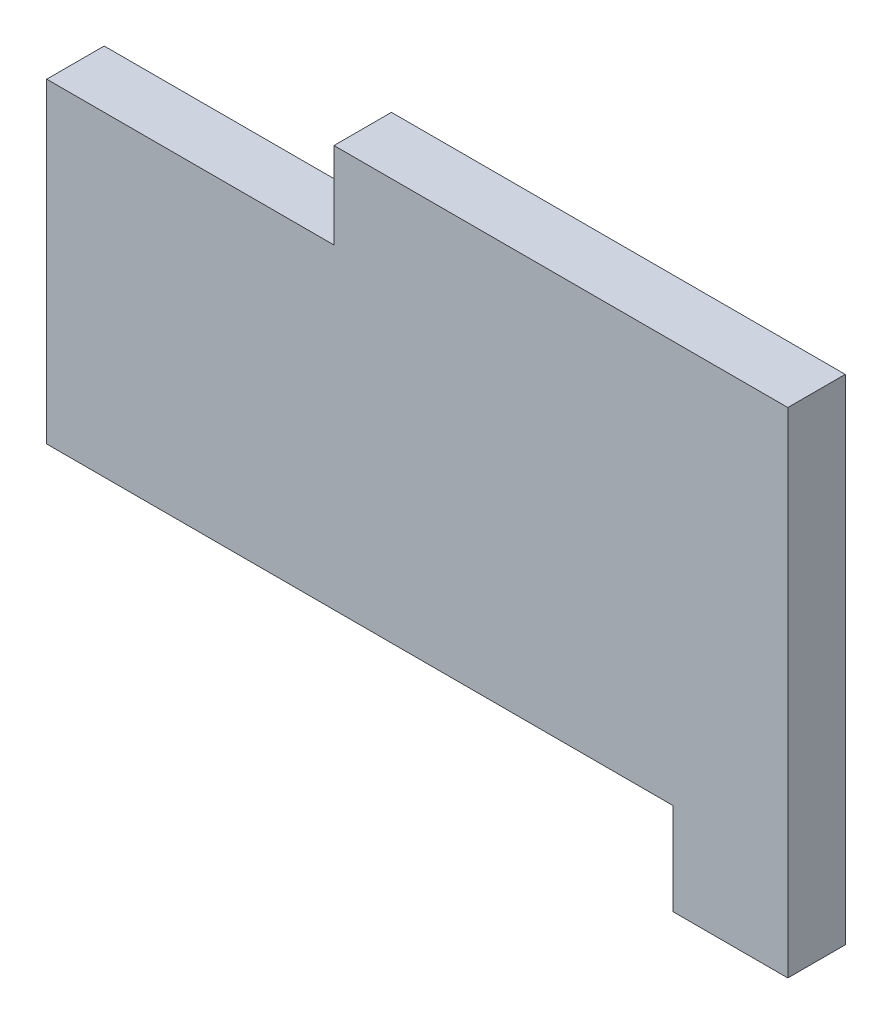
ISO-10303-21;
HEADER;
FILE_DESCRIPTION(('STEP AP214'),'2;1');
FILE_NAME('part.step','',(''),(''),'','','');
FILE_SCHEMA(('AUTOMOTIVE_DESIGN { 1 0 10303 214 1 1 1 1 }'));
ENDSEC;
DATA;
#1=APPLICATION_CONTEXT('core data for automotive mechanical design processes');
#2=APPLICATION_PROTOCOL_DEFINITION('international standard','automotive_design',2000,#1);
#3=PRODUCT_CONTEXT('',#1,'mechanical');
#4=PRODUCT('Part','Part','',(#3));
#5=PRODUCT_RELATED_PRODUCT_CATEGORY('part','',(#4));
#6=PRODUCT_DEFINITION_FORMATION('','',#4);
#7=PRODUCT_DEFINITION_CONTEXT('part definition',#1,'design');
#8=PRODUCT_DEFINITION('design','',#6,#7);
#9=PRODUCT_DEFINITION_SHAPE('','',#8);
#10=(LENGTH_UNIT() NAMED_UNIT(*) SI_UNIT(.MILLI.,.METRE.));
#11=(NAMED_UNIT(*) PLANE_ANGLE_UNIT() SI_UNIT($,.RADIAN.));
#12=(NAMED_UNIT(*) SI_UNIT($,.STERADIAN.) SOLID_ANGLE_UNIT());
#13=UNCERTAINTY_MEASURE_WITH_UNIT(LENGTH_MEASURE(1.E-05),#10,'distance_accuracy_value','');
#14=(GEOMETRIC_REPRESENTATION_CONTEXT(3) GLOBAL_UNCERTAINTY_ASSIGNED_CONTEXT((#13)) GLOBAL_UNIT_ASSIGNED_CONTEXT((#10,
#11,#12)) REPRESENTATION_CONTEXT('',''));
#15=CARTESIAN_POINT('',(0.,0.,0.));
#16=DIRECTION('',(0.,0.,1.));
#17=DIRECTION('',(1.,0.,0.));
#18=AXIS2_PLACEMENT_3D('',#15,#16,#17);
#19=CARTESIAN_POINT('',(-3.46363636363629,8.7283636363636,2.54));
#20=DIRECTION('',(0.,-1.,0.));
#21=DIRECTION('',(0.,0.,-1.));
#22=AXIS2_PLACEMENT_3D('',#19,#20,#21);
#23=PLANE('',#22);
#24=DIRECTION('',(-1.,0.,0.));
#25=VECTOR('',#24,1.);
#26=CARTESIAN_POINT('',(-3.46363636363629,8.7283636363636,0.));
#27=LINE('',#26,#25);
#28=CARTESIAN_POINT('',(-3.46363636363629,8.7283636363636,0.));
#29=VERTEX_POINT('',#28);
#30=CARTESIAN_POINT('',(-16.1636363636363,8.7283636363636,0.));
#31=VERTEX_POINT('',#30);
#32=EDGE_CURVE('E140',#29,#31,#27,.T.);
#33=ORIENTED_EDGE('',*,*,#32,.T.);
#34=DIRECTION('',(0.,0.,-1.));
#35=VECTOR('',#34,1.);
#36=CARTESIAN_POINT('',(-16.1636363636363,8.7283636363636,2.54));
#37=LINE('',#36,#35);
#38=CARTESIAN_POINT('',(-16.1636363636363,8.7283636363636,2.54));
#39=VERTEX_POINT('',#38);
#40=EDGE_CURVE('E11',#39,#31,#37,.T.);
#41=ORIENTED_EDGE('',*,*,#40,.F.);
#42=DIRECTION('',(-1.,0.,0.));
#43=VECTOR('',#42,1.);
#44=CARTESIAN_POINT('',(-3.46363636363629,8.7283636363636,2.54));
#45=LINE('',#44,#43);
#46=CARTESIAN_POINT('',(-3.46363636363629,8.7283636363636,2.54));
#47=VERTEX_POINT('',#46);
#48=EDGE_CURVE('E162',#47,#39,#45,.T.);
#49=ORIENTED_EDGE('',*,*,#48,.F.);
#50=DIRECTION('',(0.,0.,-1.));
#51=VECTOR('',#50,1.);
#52=CARTESIAN_POINT('',(-3.46363636363629,8.7283636363636,2.54));
#53=LINE('',#52,#51);
#54=EDGE_CURVE('E136',#47,#29,#53,.T.);
#55=ORIENTED_EDGE('',*,*,#54,.T.);
#56=EDGE_LOOP('',(#33,#41,#49,#55));
#57=FACE_BOUND('',#56,.T.);
#58=ADVANCED_FACE('F39',(#57),#23,.F.);
#59=CARTESIAN_POINT('',(-16.1636363636363,8.7283636363636,2.54));
#60=DIRECTION('',(1.,0.,0.));
#61=DIRECTION('',(0.,0.,-1.));
#62=AXIS2_PLACEMENT_3D('',#59,#60,#61);
#63=PLANE('',#62);
#64=DIRECTION('',(0.,-1.,0.));
#65=VECTOR('',#64,1.);
#66=CARTESIAN_POINT('',(-16.1636363636363,8.7283636363636,0.));
#67=LINE('',#66,#65);
#68=CARTESIAN_POINT('',(-16.1636363636363,-5.2416363636364,0.));
#69=VERTEX_POINT('',#68);
#70=EDGE_CURVE('E144',#31,#69,#67,.T.);
#71=ORIENTED_EDGE('',*,*,#70,.T.);
#72=DIRECTION('',(0.,0.,-1.));
#73=VECTOR('',#72,1.);
#74=CARTESIAN_POINT('',(-16.1636363636363,-5.2416363636364,2.54));
#75=LINE('',#74,#73);
#76=CARTESIAN_POINT('',(-16.1636363636363,-5.2416363636364,2.54));
#77=VERTEX_POINT('',#76);
#78=EDGE_CURVE('E48',#77,#69,#75,.T.);
#79=ORIENTED_EDGE('',*,*,#78,.F.);
#80=DIRECTION('',(0.,-1.,0.));
#81=VECTOR('',#80,1.);
#82=CARTESIAN_POINT('',(-16.1636363636363,8.7283636363636,2.54));
#83=LINE('',#82,#81);
#84=EDGE_CURVE('E99',#39,#77,#83,.T.);
#85=ORIENTED_EDGE('',*,*,#84,.F.);
#86=ORIENTED_EDGE('',*,*,#40,.T.);
#87=EDGE_LOOP('',(#71,#79,#85,#86));
#88=FACE_BOUND('',#87,.T.);
#89=ADVANCED_FACE('F208',(#88),#63,.F.);
#90=CARTESIAN_POINT('',(-16.1636363636363,-5.2416363636364,2.54));
#91=DIRECTION('',(0.,1.,0.));
#92=DIRECTION('',(-1.,0.,0.));
#93=AXIS2_PLACEMENT_3D('',#90,#91,#92);
#94=PLANE('',#93);
#95=DIRECTION('',(1.,0.,0.));
#96=VECTOR('',#95,1.);
#97=CARTESIAN_POINT('',(-16.1636363636363,-5.2416363636364,0.));
#98=LINE('',#97,#96);
#99=CARTESIAN_POINT('',(11.5223636363637,-5.2416363636364,0.));
#100=VERTEX_POINT('',#99);
#101=EDGE_CURVE('E147',#69,#100,#98,.T.);
#102=ORIENTED_EDGE('',*,*,#101,.T.);
#103=DIRECTION('',(0.,0.,-1.));
#104=VECTOR('',#103,1.);
#105=CARTESIAN_POINT('',(11.5223636363637,-5.2416363636364,2.54));
#106=LINE('',#105,#104);
#107=CARTESIAN_POINT('',(11.5223636363637,-5.2416363636364,2.54));
#108=VERTEX_POINT('',#107);
#109=EDGE_CURVE('E173',#108,#100,#106,.T.);
#110=ORIENTED_EDGE('',*,*,#109,.F.);
#111=DIRECTION('',(1.,0.,0.));
#112=VECTOR('',#111,1.);
#113=CARTESIAN_POINT('',(-16.1636363636363,-5.2416363636364,2.54));
#114=LINE('',#113,#112);
#115=EDGE_CURVE('E183',#77,#108,#114,.T.);
#116=ORIENTED_EDGE('',*,*,#115,.F.);
#117=ORIENTED_EDGE('',*,*,#78,.T.);
#118=EDGE_LOOP('',(#102,#110,#116,#117));
#119=FACE_BOUND('',#118,.T.);
#120=ADVANCED_FACE('F181',(#119),#94,.F.);
#121=CARTESIAN_POINT('',(11.5223636363637,-5.2416363636364,2.54));
#122=DIRECTION('',(1.,0.,0.));
#123=DIRECTION('',(0.,0.,-1.));
#124=AXIS2_PLACEMENT_3D('',#121,#122,#123);
#125=PLANE('',#124);
#126=DIRECTION('',(0.,-1.,0.));
#127=VECTOR('',#126,1.);
#128=CARTESIAN_POINT('',(11.5223636363637,-5.2416363636364,0.));
#129=LINE('',#128,#127);
#130=CARTESIAN_POINT('',(11.5223636363637,-9.30563636363638,0.));
#131=VERTEX_POINT('',#130);
#132=EDGE_CURVE('E150',#100,#131,#129,.T.);
#133=ORIENTED_EDGE('',*,*,#132,.T.);
#134=DIRECTION('',(0.,0.,-1.));
#135=VECTOR('',#134,1.);
#136=CARTESIAN_POINT('',(11.5223636363637,-9.30563636363638,2.54));
#137=LINE('',#136,#135);
#138=CARTESIAN_POINT('',(11.5223636363637,-9.30563636363638,2.54));
#139=VERTEX_POINT('',#138);
#140=EDGE_CURVE('E169',#139,#131,#137,.T.);
#141=ORIENTED_EDGE('',*,*,#140,.F.);
#142=DIRECTION('',(0.,-1.,0.));
#143=VECTOR('',#142,1.);
#144=CARTESIAN_POINT('',(11.5223636363637,-5.2416363636364,2.54));
#145=LINE('',#144,#143);
#146=EDGE_CURVE('E196',#108,#139,#145,.T.);
#147=ORIENTED_EDGE('',*,*,#146,.F.);
#148=ORIENTED_EDGE('',*,*,#109,.T.);
#149=EDGE_LOOP('',(#133,#141,#147,#148));
#150=FACE_BOUND('',#149,.T.);
#151=ADVANCED_FACE('F191',(#150),#125,.F.);
#152=CARTESIAN_POINT('',(11.5223636363637,-9.30563636363638,2.54));
#153=DIRECTION('',(0.,1.,0.));
#154=DIRECTION('',(-1.,0.,0.));
#155=AXIS2_PLACEMENT_3D('',#152,#153,#154);
#156=PLANE('',#155);
#157=DIRECTION('',(1.,0.,0.));
#158=VECTOR('',#157,1.);
#159=CARTESIAN_POINT('',(11.5223636363637,-9.30563636363638,0.));
#160=LINE('',#159,#158);
#161=CARTESIAN_POINT('',(16.6023636363637,-9.30563636363638,0.));
#162=VERTEX_POINT('',#161);
#163=EDGE_CURVE('E153',#131,#162,#160,.T.);
#164=ORIENTED_EDGE('',*,*,#163,.T.);
#165=DIRECTION('',(0.,0.,-1.));
#166=VECTOR('',#165,1.);
#167=CARTESIAN_POINT('',(16.6023636363637,-9.30563636363638,2.54));
#168=LINE('',#167,#166);
#169=CARTESIAN_POINT('',(16.6023636363637,-9.30563636363638,2.54));
#170=VERTEX_POINT('',#169);
#171=EDGE_CURVE('E129',#170,#162,#168,.T.);
#172=ORIENTED_EDGE('',*,*,#171,.F.);
#173=DIRECTION('',(1.,0.,0.));
#174=VECTOR('',#173,1.);
#175=CARTESIAN_POINT('',(11.5223636363637,-9.30563636363638,2.54));
#176=LINE('',#175,#174);
#177=EDGE_CURVE('E118',#139,#170,#176,.T.);
#178=ORIENTED_EDGE('',*,*,#177,.F.);
#179=ORIENTED_EDGE('',*,*,#140,.T.);
#180=EDGE_LOOP('',(#164,#172,#178,#179));
#181=FACE_BOUND('',#180,.T.);
#182=ADVANCED_FACE('F194',(#181),#156,.F.);
#183=CARTESIAN_POINT('',(16.6023636363637,-9.30563636363638,2.54));
#184=DIRECTION('',(-1.,0.,0.));
#185=DIRECTION('',(0.,-1.,0.));
#186=AXIS2_PLACEMENT_3D('',#183,#184,#185);
#187=PLANE('',#186);
#188=DIRECTION('',(0.,1.,0.));
#189=VECTOR('',#188,1.);
#190=CARTESIAN_POINT('',(16.6023636363637,-9.30563636363638,0.));
#191=LINE('',#190,#189);
#192=CARTESIAN_POINT('',(16.6023636363637,12.5383636363636,0.));
#193=VERTEX_POINT('',#192);
#194=EDGE_CURVE('E127',#162,#193,#191,.T.);
#195=ORIENTED_EDGE('',*,*,#194,.T.);
#196=DIRECTION('',(0.,0.,-1.));
#197=VECTOR('',#196,1.);
#198=CARTESIAN_POINT('',(16.6023636363637,12.5383636363636,2.54));
#199=LINE('',#198,#197);
#200=CARTESIAN_POINT('',(16.6023636363637,12.5383636363636,2.54));
#201=VERTEX_POINT('',#200);
#202=EDGE_CURVE('E124',#201,#193,#199,.T.);
#203=ORIENTED_EDGE('',*,*,#202,.F.);
#204=DIRECTION('',(0.,1.,0.));
#205=VECTOR('',#204,1.);
#206=CARTESIAN_POINT('',(16.6023636363637,-9.30563636363638,2.54));
#207=LINE('',#206,#205);
#208=EDGE_CURVE('E112',#170,#201,#207,.T.);
#209=ORIENTED_EDGE('',*,*,#208,.F.);
#210=ORIENTED_EDGE('',*,*,#171,.T.);
#211=EDGE_LOOP('',(#195,#203,#209,#210));
#212=FACE_BOUND('',#211,.T.);
#213=ADVANCED_FACE('F125',(#212),#187,.F.);
#214=CARTESIAN_POINT('',(16.6023636363637,12.5383636363636,2.54));
#215=DIRECTION('',(0.,-1.,0.));
#216=DIRECTION('',(1.,0.,0.));
#217=AXIS2_PLACEMENT_3D('',#214,#215,#216);
#218=PLANE('',#217);
#219=DIRECTION('',(-1.,0.,0.));
#220=VECTOR('',#219,1.);
#221=CARTESIAN_POINT('',(16.6023636363637,12.5383636363636,0.));
#222=LINE('',#221,#220);
#223=CARTESIAN_POINT('',(-3.46363636363629,12.5383636363636,0.));
#224=VERTEX_POINT('',#223);
#225=EDGE_CURVE('E85',#193,#224,#222,.T.);
#226=ORIENTED_EDGE('',*,*,#225,.T.);
#227=DIRECTION('',(0.,0.,-1.));
#228=VECTOR('',#227,1.);
#229=CARTESIAN_POINT('',(-3.46363636363629,12.5383636363636,2.54));
#230=LINE('',#229,#228);
#231=CARTESIAN_POINT('',(-3.46363636363629,12.5383636363636,2.54));
#232=VERTEX_POINT('',#231);
#233=EDGE_CURVE('E130',#232,#224,#230,.T.);
#234=ORIENTED_EDGE('',*,*,#233,.F.);
#235=DIRECTION('',(-1.,0.,0.));
#236=VECTOR('',#235,1.);
#237=CARTESIAN_POINT('',(16.6023636363637,12.5383636363636,2.54));
#238=LINE('',#237,#236);
#239=EDGE_CURVE('E116',#201,#232,#238,.T.);
#240=ORIENTED_EDGE('',*,*,#239,.F.);
#241=ORIENTED_EDGE('',*,*,#202,.T.);
#242=EDGE_LOOP('',(#226,#234,#240,#241));
#243=FACE_BOUND('',#242,.T.);
#244=ADVANCED_FACE('F132',(#243),#218,.F.);
#245=CARTESIAN_POINT('',(-3.46363636363629,12.5383636363636,2.54));
#246=DIRECTION('',(1.,0.,0.));
#247=DIRECTION('',(0.,1.,0.));
#248=AXIS2_PLACEMENT_3D('',#245,#246,#247);
#249=PLANE('',#248);
#250=DIRECTION('',(0.,-1.,0.));
#251=VECTOR('',#250,1.);
#252=CARTESIAN_POINT('',(-3.46363636363629,12.5383636363636,0.));
#253=LINE('',#252,#251);
#254=EDGE_CURVE('E91',#224,#29,#253,.T.);
#255=ORIENTED_EDGE('',*,*,#254,.T.);
#256=ORIENTED_EDGE('',*,*,#54,.F.);
#257=DIRECTION('',(0.,-1.,0.));
#258=VECTOR('',#257,1.);
#259=CARTESIAN_POINT('',(-3.46363636363629,12.5383636363636,2.54));
#260=LINE('',#259,#258);
#261=EDGE_CURVE('E56',#232,#47,#260,.T.);
#262=ORIENTED_EDGE('',*,*,#261,.F.);
#263=ORIENTED_EDGE('',*,*,#233,.T.);
#264=EDGE_LOOP('',(#255,#256,#262,#263));
#265=FACE_BOUND('',#264,.T.);
#266=ADVANCED_FACE('F224',(#265),#249,.F.);
#267=CARTESIAN_POINT('',(0.,0.,2.54));
#268=DIRECTION('',(0.,0.,1.));
#269=DIRECTION('',(1.,0.,0.));
#270=AXIS2_PLACEMENT_3D('',#267,#268,#269);
#271=PLANE('',#270);
#272=ORIENTED_EDGE('',*,*,#48,.T.);
#273=ORIENTED_EDGE('',*,*,#84,.T.);
#274=ORIENTED_EDGE('',*,*,#115,.T.);
#275=ORIENTED_EDGE('',*,*,#146,.T.);
#276=ORIENTED_EDGE('',*,*,#177,.T.);
#277=ORIENTED_EDGE('',*,*,#208,.T.);
#278=ORIENTED_EDGE('',*,*,#239,.T.);
#279=ORIENTED_EDGE('',*,*,#261,.T.);
#280=EDGE_LOOP('',(#272,#273,#274,#275,#276,#277,#278,#279));
#281=FACE_BOUND('',#280,.T.);
#282=ADVANCED_FACE('F114',(#281),#271,.T.);
#283=CARTESIAN_POINT('',(0.,0.,0.));
#284=DIRECTION('',(0.,0.,1.));
#285=DIRECTION('',(1.,0.,0.));
#286=AXIS2_PLACEMENT_3D('',#283,#284,#285);
#287=PLANE('',#286);
#288=ORIENTED_EDGE('',*,*,#32,.F.);
#289=ORIENTED_EDGE('',*,*,#254,.F.);
#290=ORIENTED_EDGE('',*,*,#225,.F.);
#291=ORIENTED_EDGE('',*,*,#194,.F.);
#292=ORIENTED_EDGE('',*,*,#163,.F.);
#293=ORIENTED_EDGE('',*,*,#132,.F.);
#294=ORIENTED_EDGE('',*,*,#101,.F.);
#295=ORIENTED_EDGE('',*,*,#70,.F.);
#296=EDGE_LOOP('',(#288,#289,#290,#291,#292,#293,#294,#295));
#297=FACE_BOUND('',#296,.T.);
#298=ADVANCED_FACE('F187',(#297),#287,.F.);
#299=CLOSED_SHELL('',(#58,#89,#120,#151,#182,#213,#244,#266,#282,#298));
#300=MANIFOLD_SOLID_BREP('B2',#299);
#301=ADVANCED_BREP_SHAPE_REPRESENTATION('',(#18,#300),#14);
#302=SHAPE_DEFINITION_REPRESENTATION(#9,#301);
ENDSEC;
END-ISO-10303-21;
